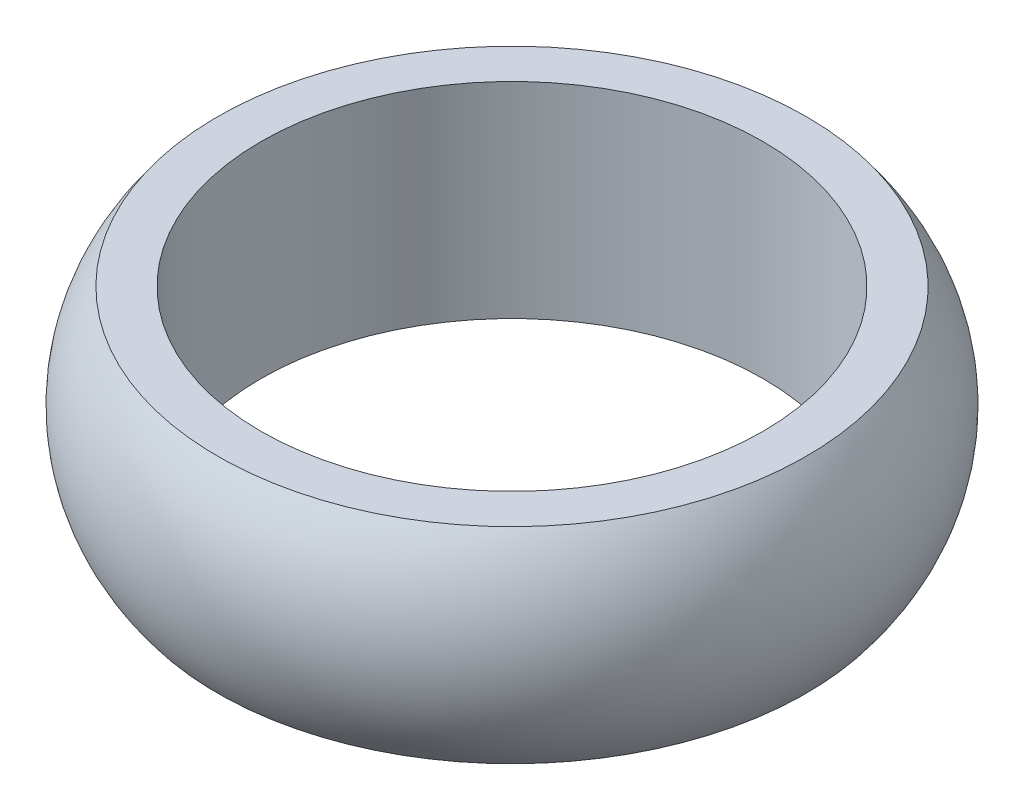
ISO-10303-21;
HEADER;
FILE_DESCRIPTION(('STEP AP214'),'2;1');
FILE_NAME('part.step','',(''),(''),'','','');
FILE_SCHEMA(('AUTOMOTIVE_DESIGN { 1 0 10303 214 1 1 1 1 }'));
ENDSEC;
DATA;
#1=APPLICATION_CONTEXT('core data for automotive mechanical design processes');
#2=APPLICATION_PROTOCOL_DEFINITION('international standard','automotive_design',2000,#1);
#3=PRODUCT_CONTEXT('',#1,'mechanical');
#4=PRODUCT('Part','Part','',(#3));
#5=PRODUCT_RELATED_PRODUCT_CATEGORY('part','',(#4));
#6=PRODUCT_DEFINITION_FORMATION('','',#4);
#7=PRODUCT_DEFINITION_CONTEXT('part definition',#1,'design');
#8=PRODUCT_DEFINITION('design','',#6,#7);
#9=PRODUCT_DEFINITION_SHAPE('','',#8);
#10=(LENGTH_UNIT() NAMED_UNIT(*) SI_UNIT(.MILLI.,.METRE.));
#11=(NAMED_UNIT(*) PLANE_ANGLE_UNIT() SI_UNIT($,.RADIAN.));
#12=(NAMED_UNIT(*) SI_UNIT($,.STERADIAN.) SOLID_ANGLE_UNIT());
#13=UNCERTAINTY_MEASURE_WITH_UNIT(LENGTH_MEASURE(1.E-05),#10,'distance_accuracy_value','');
#14=(GEOMETRIC_REPRESENTATION_CONTEXT(3) GLOBAL_UNCERTAINTY_ASSIGNED_CONTEXT((#13)) GLOBAL_UNIT_ASSIGNED_CONTEXT((#10,
#11,#12)) REPRESENTATION_CONTEXT('',''));
#15=CARTESIAN_POINT('',(0.,0.,0.));
#16=DIRECTION('',(0.,0.,1.));
#17=DIRECTION('',(1.,0.,0.));
#18=AXIS2_PLACEMENT_3D('',#15,#16,#17);
#19=CARTESIAN_POINT('',(0.,0.,0.));
#20=DIRECTION('',(0.,-1.,0.));
#21=DIRECTION('',(0.,0.,-1.));
#22=AXIS2_PLACEMENT_3D('',#19,#20,#21);
#23=DEGENERATE_TOROIDAL_SURFACE('',#22,7.53265290519878,7.71734709480123,.T.);
#24=CARTESIAN_POINT('',(0.,4.75,0.));
#25=DIRECTION('',(0.,-1.,0.));
#26=DIRECTION('',(0.,0.,-1.));
#27=AXIS2_PLACEMENT_3D('',#24,#25,#26);
#28=CIRCLE('',#27,13.615);
#29=CARTESIAN_POINT('',(0.,4.75,-13.615));
#30=VERTEX_POINT('',#29);
#31=EDGE_CURVE('E47',#30,#30,#28,.T.);
#32=ORIENTED_EDGE('',*,*,#31,.T.);
#33=EDGE_LOOP('',(#32));
#34=FACE_BOUND('',#33,.T.);
#35=CARTESIAN_POINT('',(0.,-4.75,0.));
#36=DIRECTION('',(0.,-1.,0.));
#37=DIRECTION('',(0.,0.,-1.));
#38=AXIS2_PLACEMENT_3D('',#35,#36,#37);
#39=CIRCLE('',#38,13.615);
#40=CARTESIAN_POINT('',(0.,-4.75,-13.615));
#41=VERTEX_POINT('',#40);
#42=EDGE_CURVE('E10',#41,#41,#39,.T.);
#43=ORIENTED_EDGE('',*,*,#42,.F.);
#44=EDGE_LOOP('',(#43));
#45=FACE_BOUND('',#44,.T.);
#46=ADVANCED_FACE('F33',(#34,#45),#23,.T.);
#47=CARTESIAN_POINT('',(11.615,-4.75,0.));
#48=DIRECTION('',(0.,-1.,0.));
#49=DIRECTION('',(0.,0.,-1.));
#50=AXIS2_PLACEMENT_3D('',#47,#48,#49);
#51=PLANE('',#50);
#52=ORIENTED_EDGE('',*,*,#42,.T.);
#53=EDGE_LOOP('',(#52));
#54=FACE_BOUND('',#53,.T.);
#55=CARTESIAN_POINT('',(0.,-4.75,0.));
#56=DIRECTION('',(0.,-1.,0.));
#57=DIRECTION('',(0.,0.,-1.));
#58=AXIS2_PLACEMENT_3D('',#55,#56,#57);
#59=CIRCLE('',#58,11.615);
#60=CARTESIAN_POINT('',(0.,-4.75,-11.615));
#61=VERTEX_POINT('',#60);
#62=EDGE_CURVE('E39',#61,#61,#59,.T.);
#63=ORIENTED_EDGE('',*,*,#62,.F.);
#64=EDGE_LOOP('',(#63));
#65=FACE_BOUND('',#64,.T.);
#66=ADVANCED_FACE('F63',(#54,#65),#51,.T.);
#67=CARTESIAN_POINT('',(0.,0.,0.));
#68=DIRECTION('',(0.,-1.,0.));
#69=DIRECTION('',(0.,0.,-1.));
#70=AXIS2_PLACEMENT_3D('',#67,#68,#69);
#71=CYLINDRICAL_SURFACE('',#70,11.615);
#72=ORIENTED_EDGE('',*,*,#62,.T.);
#73=EDGE_LOOP('',(#72));
#74=FACE_BOUND('',#73,.T.);
#75=CARTESIAN_POINT('',(0.,4.75,0.));
#76=DIRECTION('',(0.,-1.,0.));
#77=DIRECTION('',(0.,0.,-1.));
#78=AXIS2_PLACEMENT_3D('',#75,#76,#77);
#79=CIRCLE('',#78,11.615);
#80=CARTESIAN_POINT('',(0.,4.75,-11.615));
#81=VERTEX_POINT('',#80);
#82=EDGE_CURVE('E43',#81,#81,#79,.T.);
#83=ORIENTED_EDGE('',*,*,#82,.F.);
#84=EDGE_LOOP('',(#83));
#85=FACE_BOUND('',#84,.T.);
#86=ADVANCED_FACE('F57',(#74,#85),#71,.F.);
#87=CARTESIAN_POINT('',(11.615,4.75,0.));
#88=DIRECTION('',(0.,1.,0.));
#89=DIRECTION('',(0.,0.,1.));
#90=AXIS2_PLACEMENT_3D('',#87,#88,#89);
#91=PLANE('',#90);
#92=ORIENTED_EDGE('',*,*,#82,.T.);
#93=EDGE_LOOP('',(#92));
#94=FACE_BOUND('',#93,.T.);
#95=ORIENTED_EDGE('',*,*,#31,.F.);
#96=EDGE_LOOP('',(#95));
#97=FACE_BOUND('',#96,.T.);
#98=ADVANCED_FACE('F55',(#94,#97),#91,.T.);
#99=CLOSED_SHELL('',(#46,#66,#86,#98));
#100=MANIFOLD_SOLID_BREP('B2',#99);
#101=ADVANCED_BREP_SHAPE_REPRESENTATION('',(#18,#100),#14);
#102=SHAPE_DEFINITION_REPRESENTATION(#9,#101);
ENDSEC;
END-ISO-10303-21;
